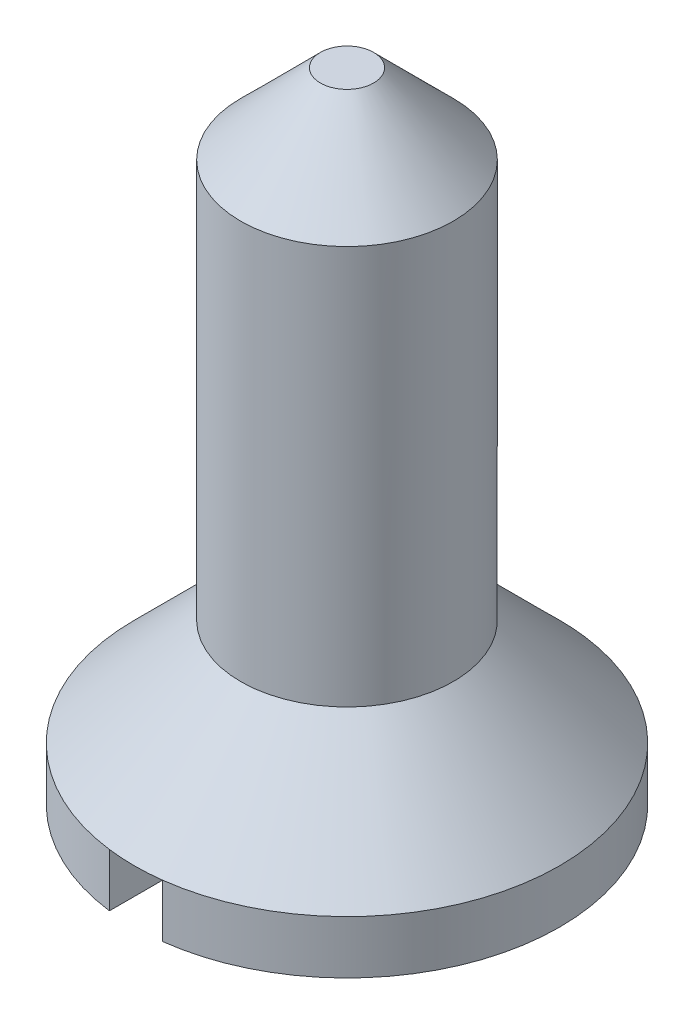
ISO-10303-21;
HEADER;
FILE_DESCRIPTION(('STEP AP214'),'2;1');
FILE_NAME('part.step','',(''),(''),'','','');
FILE_SCHEMA(('AUTOMOTIVE_DESIGN { 1 0 10303 214 1 1 1 1 }'));
ENDSEC;
DATA;
#1=APPLICATION_CONTEXT('core data for automotive mechanical design processes');
#2=APPLICATION_PROTOCOL_DEFINITION('international standard','automotive_design',2000,#1);
#3=PRODUCT_CONTEXT('',#1,'mechanical');
#4=PRODUCT('Part','Part','',(#3));
#5=PRODUCT_RELATED_PRODUCT_CATEGORY('part','',(#4));
#6=PRODUCT_DEFINITION_FORMATION('','',#4);
#7=PRODUCT_DEFINITION_CONTEXT('part definition',#1,'design');
#8=PRODUCT_DEFINITION('design','',#6,#7);
#9=PRODUCT_DEFINITION_SHAPE('','',#8);
#10=(LENGTH_UNIT() NAMED_UNIT(*) SI_UNIT(.MILLI.,.METRE.));
#11=(NAMED_UNIT(*) PLANE_ANGLE_UNIT() SI_UNIT($,.RADIAN.));
#12=(NAMED_UNIT(*) SI_UNIT($,.STERADIAN.) SOLID_ANGLE_UNIT());
#13=UNCERTAINTY_MEASURE_WITH_UNIT(LENGTH_MEASURE(1.E-05),#10,'distance_accuracy_value','');
#14=(GEOMETRIC_REPRESENTATION_CONTEXT(3) GLOBAL_UNCERTAINTY_ASSIGNED_CONTEXT((#13)) GLOBAL_UNIT_ASSIGNED_CONTEXT((#10,
#11,#12)) REPRESENTATION_CONTEXT('',''));
#15=CARTESIAN_POINT('',(0.,0.,0.));
#16=DIRECTION('',(0.,0.,1.));
#17=DIRECTION('',(1.,0.,0.));
#18=AXIS2_PLACEMENT_3D('',#15,#16,#17);
#19=CARTESIAN_POINT('',(0.,12.,0.));
#20=DIRECTION('',(0.,1.,0.));
#21=DIRECTION('',(-1.,0.,0.));
#22=AXIS2_PLACEMENT_3D('',#19,#20,#21);
#23=CYLINDRICAL_SURFACE('',#22,4.);
#24=CARTESIAN_POINT('',(0.,0.,0.));
#25=DIRECTION('',(0.,1.,0.));
#26=DIRECTION('',(-1.,0.,0.));
#27=AXIS2_PLACEMENT_3D('',#24,#25,#26);
#28=CIRCLE('',#27,4.);
#29=CARTESIAN_POINT('',(-0.5,0.,-3.96862696659689));
#30=VERTEX_POINT('',#29);
#31=CARTESIAN_POINT('',(-0.5,0.,3.96862696659689));
#32=VERTEX_POINT('',#31);
#33=EDGE_CURVE('E91',#30,#32,#28,.T.);
#34=ORIENTED_EDGE('',*,*,#33,.T.);
#35=DIRECTION('',(0.,1.,0.));
#36=VECTOR('',#35,1.);
#37=CARTESIAN_POINT('',(-0.5,12.,3.96862696659689));
#38=LINE('',#37,#36);
#39=CARTESIAN_POINT('',(-0.5,1.,3.96862696659689));
#40=VERTEX_POINT('',#39);
#41=EDGE_CURVE('E52',#32,#40,#38,.T.);
#42=ORIENTED_EDGE('',*,*,#41,.T.);
#43=CARTESIAN_POINT('',(0.,0.999999999999977,0.));
#44=DIRECTION('',(0.,1.,0.));
#45=DIRECTION('',(-1.,0.,0.));
#46=AXIS2_PLACEMENT_3D('',#43,#44,#45);
#47=CIRCLE('',#46,4.);
#48=CARTESIAN_POINT('',(-0.5,1.,-3.96862696659689));
#49=VERTEX_POINT('',#48);
#50=EDGE_CURVE('E90',#49,#40,#47,.T.);
#51=ORIENTED_EDGE('',*,*,#50,.F.);
#52=DIRECTION('',(0.,1.,0.));
#53=VECTOR('',#52,1.);
#54=CARTESIAN_POINT('',(-0.5,12.,-3.96862696659689));
#55=LINE('',#54,#53);
#56=EDGE_CURVE('E149',#49,#30,#55,.F.);
#57=ORIENTED_EDGE('',*,*,#56,.T.);
#58=EDGE_LOOP('',(#34,#42,#51,#57));
#59=FACE_BOUND('',#58,.T.);
#60=ADVANCED_FACE('F29',(#59),#23,.T.);
#61=CARTESIAN_POINT('',(-2.,0.,0.));
#62=DIRECTION('',(0.,1.,0.));
#63=DIRECTION('',(-1.,0.,0.));
#64=AXIS2_PLACEMENT_3D('',#61,#62,#63);
#65=PLANE('',#64);
#66=ORIENTED_EDGE('',*,*,#33,.F.);
#67=DIRECTION('',(0.,0.,1.));
#68=VECTOR('',#67,1.);
#69=CARTESIAN_POINT('',(-0.5,0.,0.));
#70=LINE('',#69,#68);
#71=EDGE_CURVE('E77',#30,#32,#70,.T.);
#72=ORIENTED_EDGE('',*,*,#71,.T.);
#73=EDGE_LOOP('',(#66,#72));
#74=FACE_BOUND('',#73,.T.);
#75=ADVANCED_FACE('F121',(#74),#65,.F.);
#76=CARTESIAN_POINT('',(0.,12.,0.));
#77=DIRECTION('',(0.,1.,0.));
#78=DIRECTION('',(-1.,0.,0.));
#79=AXIS2_PLACEMENT_3D('',#76,#77,#78);
#80=CYLINDRICAL_SURFACE('',#79,2.);
#81=CARTESIAN_POINT('',(0.,10.5,0.));
#82=DIRECTION('',(0.,-1.,0.));
#83=DIRECTION('',(1.,0.,0.));
#84=AXIS2_PLACEMENT_3D('',#81,#82,#83);
#85=CIRCLE('',#84,2.);
#86=CARTESIAN_POINT('',(2.,10.5,0.));
#87=VERTEX_POINT('',#86);
#88=EDGE_CURVE('E11',#87,#87,#85,.T.);
#89=ORIENTED_EDGE('',*,*,#88,.T.);
#90=EDGE_LOOP('',(#89));
#91=FACE_BOUND('',#90,.T.);
#92=CARTESIAN_POINT('',(0.,3.,0.));
#93=DIRECTION('',(0.,1.,0.));
#94=DIRECTION('',(-1.,0.,0.));
#95=AXIS2_PLACEMENT_3D('',#92,#93,#94);
#96=CIRCLE('',#95,2.);
#97=CARTESIAN_POINT('',(-2.,3.,0.));
#98=VERTEX_POINT('',#97);
#99=EDGE_CURVE('E78',#98,#98,#96,.T.);
#100=ORIENTED_EDGE('',*,*,#99,.T.);
#101=EDGE_LOOP('',(#100));
#102=FACE_BOUND('',#101,.T.);
#103=ADVANCED_FACE('F31',(#91,#102),#80,.T.);
#104=CARTESIAN_POINT('',(0.,0.999999999999977,0.));
#105=DIRECTION('',(0.,-1.,0.));
#106=DIRECTION('',(1.,0.,0.));
#107=AXIS2_PLACEMENT_3D('',#104,#105,#106);
#108=CONICAL_SURFACE('',#107,4.,0.785398163397443);
#109=ORIENTED_EDGE('',*,*,#99,.F.);
#110=EDGE_LOOP('',(#109));
#111=FACE_BOUND('',#110,.T.);
#112=CARTESIAN_POINT('',(0.5,1.,3.96862696659689));
#113=VERTEX_POINT('',#112);
#114=EDGE_CURVE('E96',#40,#113,#47,.T.);
#115=ORIENTED_EDGE('',*,*,#114,.T.);
#116=CARTESIAN_POINT('',(0.5,1.,-3.96862696659689));
#117=VERTEX_POINT('',#116);
#118=EDGE_CURVE('E85',#113,#117,#47,.T.);
#119=ORIENTED_EDGE('',*,*,#118,.T.);
#120=EDGE_CURVE('E94',#117,#49,#47,.T.);
#121=ORIENTED_EDGE('',*,*,#120,.T.);
#122=ORIENTED_EDGE('',*,*,#50,.T.);
#123=EDGE_LOOP('',(#115,#119,#121,#122));
#124=FACE_BOUND('',#123,.T.);
#125=ADVANCED_FACE('F130',(#111,#124),#108,.T.);
#126=CARTESIAN_POINT('',(0.5,0.,3.96862696659689));
#127=VERTEX_POINT('',#126);
#128=CARTESIAN_POINT('',(0.5,0.,-3.96862696659689));
#129=VERTEX_POINT('',#128);
#130=EDGE_CURVE('E83',#127,#129,#28,.T.);
#131=ORIENTED_EDGE('',*,*,#130,.T.);
#132=DIRECTION('',(0.,1.,0.));
#133=VECTOR('',#132,1.);
#134=CARTESIAN_POINT('',(0.5,12.,-3.96862696659689));
#135=LINE('',#134,#133);
#136=EDGE_CURVE('E44',#129,#117,#135,.T.);
#137=ORIENTED_EDGE('',*,*,#136,.T.);
#138=ORIENTED_EDGE('',*,*,#118,.F.);
#139=DIRECTION('',(0.,1.,0.));
#140=VECTOR('',#139,1.);
#141=CARTESIAN_POINT('',(0.5,12.,3.96862696659689));
#142=LINE('',#141,#140);
#143=EDGE_CURVE('E72',#113,#127,#142,.F.);
#144=ORIENTED_EDGE('',*,*,#143,.T.);
#145=EDGE_LOOP('',(#131,#137,#138,#144));
#146=FACE_BOUND('',#145,.T.);
#147=ADVANCED_FACE('F82',(#146),#23,.T.);
#148=ORIENTED_EDGE('',*,*,#130,.F.);
#149=DIRECTION('',(0.,0.,-1.));
#150=VECTOR('',#149,1.);
#151=CARTESIAN_POINT('',(0.5,0.,0.));
#152=LINE('',#151,#150);
#153=EDGE_CURVE('E69',#127,#129,#152,.T.);
#154=ORIENTED_EDGE('',*,*,#153,.T.);
#155=EDGE_LOOP('',(#148,#154));
#156=FACE_BOUND('',#155,.T.);
#157=ADVANCED_FACE('F89',(#156),#65,.F.);
#158=CARTESIAN_POINT('',(-2.,12.,0.));
#159=DIRECTION('',(0.,-1.,0.));
#160=DIRECTION('',(1.,0.,0.));
#161=AXIS2_PLACEMENT_3D('',#158,#159,#160);
#162=PLANE('',#161);
#163=CARTESIAN_POINT('',(0.,12.,0.));
#164=DIRECTION('',(0.,-1.,0.));
#165=DIRECTION('',(1.,0.,0.));
#166=AXIS2_PLACEMENT_3D('',#163,#164,#165);
#167=CIRCLE('',#166,0.500000000000004);
#168=CARTESIAN_POINT('',(0.500000000000003,12.,0.));
#169=VERTEX_POINT('',#168);
#170=EDGE_CURVE('E37',#169,#169,#167,.F.);
#171=ORIENTED_EDGE('',*,*,#170,.T.);
#172=EDGE_LOOP('',(#171));
#173=FACE_BOUND('',#172,.T.);
#174=ADVANCED_FACE('F106',(#173),#162,.F.);
#175=CARTESIAN_POINT('',(-0.5,1.,-10.));
#176=DIRECTION('',(0.,1.,0.));
#177=DIRECTION('',(0.,0.,1.));
#178=AXIS2_PLACEMENT_3D('',#175,#176,#177);
#179=PLANE('',#178);
#180=DIRECTION('',(0.,0.,1.));
#181=VECTOR('',#180,1.);
#182=CARTESIAN_POINT('',(0.5,1.,-10.));
#183=LINE('',#182,#181);
#184=EDGE_CURVE('E147',#117,#113,#183,.T.);
#185=ORIENTED_EDGE('',*,*,#184,.T.);
#186=ORIENTED_EDGE('',*,*,#114,.F.);
#187=DIRECTION('',(0.,0.,1.));
#188=VECTOR('',#187,1.);
#189=CARTESIAN_POINT('',(-0.5,1.,-10.));
#190=LINE('',#189,#188);
#191=EDGE_CURVE('E87',#49,#40,#190,.T.);
#192=ORIENTED_EDGE('',*,*,#191,.F.);
#193=ORIENTED_EDGE('',*,*,#120,.F.);
#194=EDGE_LOOP('',(#185,#186,#192,#193));
#195=FACE_BOUND('',#194,.T.);
#196=ADVANCED_FACE('F146',(#195),#179,.F.);
#197=CARTESIAN_POINT('',(-0.5,0.,-10.));
#198=DIRECTION('',(-1.,0.,0.));
#199=DIRECTION('',(0.,0.,1.));
#200=AXIS2_PLACEMENT_3D('',#197,#198,#199);
#201=PLANE('',#200);
#202=ORIENTED_EDGE('',*,*,#71,.F.);
#203=ORIENTED_EDGE('',*,*,#56,.F.);
#204=ORIENTED_EDGE('',*,*,#191,.T.);
#205=ORIENTED_EDGE('',*,*,#41,.F.);
#206=EDGE_LOOP('',(#202,#203,#204,#205));
#207=FACE_BOUND('',#206,.T.);
#208=ADVANCED_FACE('F116',(#207),#201,.F.);
#209=CARTESIAN_POINT('',(0.5,0.,-10.));
#210=DIRECTION('',(1.,0.,0.));
#211=DIRECTION('',(0.,0.,-1.));
#212=AXIS2_PLACEMENT_3D('',#209,#210,#211);
#213=PLANE('',#212);
#214=ORIENTED_EDGE('',*,*,#153,.F.);
#215=ORIENTED_EDGE('',*,*,#143,.F.);
#216=ORIENTED_EDGE('',*,*,#184,.F.);
#217=ORIENTED_EDGE('',*,*,#136,.F.);
#218=EDGE_LOOP('',(#214,#215,#216,#217));
#219=FACE_BOUND('',#218,.T.);
#220=ADVANCED_FACE('F71',(#219),#213,.F.);
#221=CARTESIAN_POINT('',(0.,12.,0.));
#222=DIRECTION('',(0.,-1.,0.));
#223=DIRECTION('',(1.,0.,0.));
#224=AXIS2_PLACEMENT_3D('',#221,#222,#223);
#225=CONICAL_SURFACE('',#224,0.500000000000004,0.785398163397447);
#226=CARTESIAN_POINT('',(2.,10.5,0.));
#227=CARTESIAN_POINT('',(1.984375,10.515625,0.));
#228=CARTESIAN_POINT('',(1.96875,10.53125,0.));
#229=CARTESIAN_POINT('',(1.9375,10.5625,0.));
#230=CARTESIAN_POINT('',(1.921875,10.578125,0.));
#231=CARTESIAN_POINT('',(1.890625,10.609375,0.));
#232=CARTESIAN_POINT('',(1.875,10.625,0.));
#233=CARTESIAN_POINT('',(1.84375,10.65625,0.));
#234=CARTESIAN_POINT('',(1.828125,10.671875,0.));
#235=CARTESIAN_POINT('',(1.796875,10.703125,0.));
#236=CARTESIAN_POINT('',(1.78125,10.71875,0.));
#237=CARTESIAN_POINT('',(1.75,10.75,0.));
#238=CARTESIAN_POINT('',(1.734375,10.765625,0.));
#239=CARTESIAN_POINT('',(1.703125,10.796875,0.));
#240=CARTESIAN_POINT('',(1.6875,10.8125,0.));
#241=CARTESIAN_POINT('',(1.65625,10.84375,0.));
#242=CARTESIAN_POINT('',(1.640625,10.859375,0.));
#243=CARTESIAN_POINT('',(1.609375,10.890625,0.));
#244=CARTESIAN_POINT('',(1.59375,10.90625,0.));
#245=CARTESIAN_POINT('',(1.5625,10.9375,0.));
#246=CARTESIAN_POINT('',(1.546875,10.953125,0.));
#247=CARTESIAN_POINT('',(1.515625,10.984375,0.));
#248=CARTESIAN_POINT('',(1.5,11.,0.));
#249=CARTESIAN_POINT('',(1.46875,11.03125,0.));
#250=CARTESIAN_POINT('',(1.453125,11.046875,0.));
#251=CARTESIAN_POINT('',(1.421875,11.078125,0.));
#252=CARTESIAN_POINT('',(1.40625,11.09375,0.));
#253=CARTESIAN_POINT('',(1.375,11.125,0.));
#254=CARTESIAN_POINT('',(1.359375,11.140625,0.));
#255=CARTESIAN_POINT('',(1.328125,11.171875,0.));
#256=CARTESIAN_POINT('',(1.3125,11.1875,0.));
#257=CARTESIAN_POINT('',(1.28125,11.21875,0.));
#258=CARTESIAN_POINT('',(1.265625,11.234375,0.));
#259=CARTESIAN_POINT('',(1.234375,11.265625,0.));
#260=CARTESIAN_POINT('',(1.21875,11.28125,0.));
#261=CARTESIAN_POINT('',(1.1875,11.3125,0.));
#262=CARTESIAN_POINT('',(1.171875,11.328125,0.));
#263=CARTESIAN_POINT('',(1.140625,11.359375,0.));
#264=CARTESIAN_POINT('',(1.125,11.375,0.));
#265=CARTESIAN_POINT('',(1.09375,11.40625,0.));
#266=CARTESIAN_POINT('',(1.078125,11.421875,0.));
#267=CARTESIAN_POINT('',(1.046875,11.453125,0.));
#268=CARTESIAN_POINT('',(1.03125,11.46875,0.));
#269=CARTESIAN_POINT('',(1.,11.5,0.));
#270=CARTESIAN_POINT('',(0.984375000000001,11.515625,0.));
#271=CARTESIAN_POINT('',(0.953125000000001,11.546875,0.));
#272=CARTESIAN_POINT('',(0.937500000000001,11.5625,0.));
#273=CARTESIAN_POINT('',(0.906250000000001,11.59375,0.));
#274=CARTESIAN_POINT('',(0.890625000000001,11.609375,0.));
#275=CARTESIAN_POINT('',(0.859375000000001,11.640625,0.));
#276=CARTESIAN_POINT('',(0.843750000000002,11.65625,0.));
#277=CARTESIAN_POINT('',(0.812500000000002,11.6875,0.));
#278=CARTESIAN_POINT('',(0.796875000000002,11.703125,0.));
#279=CARTESIAN_POINT('',(0.765625000000002,11.734375,0.));
#280=CARTESIAN_POINT('',(0.750000000000002,11.75,0.));
#281=CARTESIAN_POINT('',(0.718750000000002,11.78125,0.));
#282=CARTESIAN_POINT('',(0.703125000000002,11.796875,0.));
#283=CARTESIAN_POINT('',(0.671875000000002,11.828125,0.));
#284=CARTESIAN_POINT('',(0.656250000000002,11.84375,0.));
#285=CARTESIAN_POINT('',(0.625000000000002,11.875,0.));
#286=CARTESIAN_POINT('',(0.609375000000002,11.890625,0.));
#287=CARTESIAN_POINT('',(0.578125000000003,11.921875,0.));
#288=CARTESIAN_POINT('',(0.562500000000002,11.9375,0.));
#289=CARTESIAN_POINT('',(0.531250000000002,11.96875,0.));
#290=CARTESIAN_POINT('',(0.515625000000002,11.984375,0.));
#291=CARTESIAN_POINT('',(0.500000000000003,12.,0.));
#292=B_SPLINE_CURVE_WITH_KNOTS('',3,(#226,#227,#228,#229,#230,#231,#232,#233,#234,#235,#236,
#237,#238,#239,#240,#241,#242,#243,#244,#245,#246,#247,#248,#249,#250,#251,#252,#253,#254,#255,
#256,#257,#258,#259,#260,#261,#262,#263,#264,#265,#266,#267,#268,#269,#270,#271,#272,#273,#274,
#275,#276,#277,#278,#279,#280,#281,#282,#283,#284,#285,#286,#287,#288,#289,#290,#291),
.UNSPECIFIED.,.F.,.F.,(4,2,2,2,2,2,2,2,2,2,2,2,2,2,2,2,2,2,2,2,2,2,2,2,2,2,2,2,2,2,2,2,4),(0.,
0.06629126073624,0.132582521472478,0.198873782208716,0.265165042944955,0.331456303681194,
0.397747564417432,0.464038825153671,0.53033008588991,0.596621346626149,0.662912607362388,
0.729203868098626,0.795495128834865,0.861786389571104,0.928077650307343,0.994368911043581,
1.06066017177982,1.12695143251606,1.1932426932523,1.25953395398854,1.32582521472478,
1.39211647546101,1.45840773619725,1.52469899693349,1.59099025766973,1.65728151840597,
1.72357277914221,1.78986403987845,1.85615530061469,1.92244656135092,1.98873782208716,
2.0550290828234,2.12132034355964),.UNSPECIFIED.);
#293=EDGE_CURVE('BSEAM108',#87,#169,#292,.T.);
#294=ORIENTED_EDGE('',*,*,#88,.F.);
#295=ORIENTED_EDGE('',*,*,#170,.F.);
#296=ORIENTED_EDGE('',*,*,#293,.T.);
#297=ORIENTED_EDGE('',*,*,#293,.F.);
#298=EDGE_LOOP('',(#294,#296,#295,#297));
#299=FACE_BOUND('',#298,.T.);
#300=ADVANCED_FACE('F108',(#299),#225,.T.);
#301=CLOSED_SHELL('',(#60,#75,#103,#125,#147,#157,#174,#196,#208,#220,#300));
#302=MANIFOLD_SOLID_BREP('B2',#301);
#303=ADVANCED_BREP_SHAPE_REPRESENTATION('',(#18,#302),#14);
#304=SHAPE_DEFINITION_REPRESENTATION(#9,#303);
ENDSEC;
END-ISO-10303-21;
